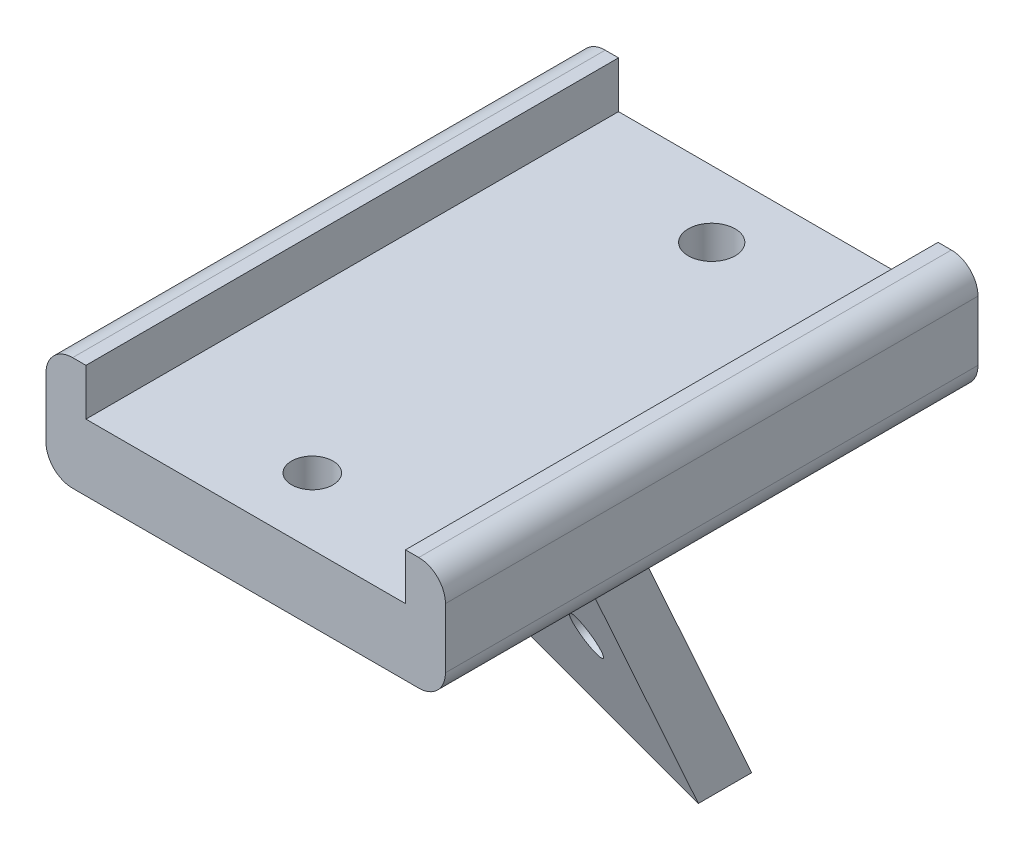
ISO-10303-21;
HEADER;
FILE_DESCRIPTION(('STEP AP214'),'2;1');
FILE_NAME('part.step','',(''),(''),'','','');
FILE_SCHEMA(('AUTOMOTIVE_DESIGN { 1 0 10303 214 1 1 1 1 }'));
ENDSEC;
DATA;
#1=APPLICATION_CONTEXT('core data for automotive mechanical design processes');
#2=APPLICATION_PROTOCOL_DEFINITION('international standard','automotive_design',2000,#1);
#3=PRODUCT_CONTEXT('',#1,'mechanical');
#4=PRODUCT('Part','Part','',(#3));
#5=PRODUCT_RELATED_PRODUCT_CATEGORY('part','',(#4));
#6=PRODUCT_DEFINITION_FORMATION('','',#4);
#7=PRODUCT_DEFINITION_CONTEXT('part definition',#1,'design');
#8=PRODUCT_DEFINITION('design','',#6,#7);
#9=PRODUCT_DEFINITION_SHAPE('','',#8);
#10=(LENGTH_UNIT() NAMED_UNIT(*) SI_UNIT(.MILLI.,.METRE.));
#11=(NAMED_UNIT(*) PLANE_ANGLE_UNIT() SI_UNIT($,.RADIAN.));
#12=(NAMED_UNIT(*) SI_UNIT($,.STERADIAN.) SOLID_ANGLE_UNIT());
#13=UNCERTAINTY_MEASURE_WITH_UNIT(LENGTH_MEASURE(1.E-05),#10,'distance_accuracy_value','');
#14=(GEOMETRIC_REPRESENTATION_CONTEXT(3) GLOBAL_UNCERTAINTY_ASSIGNED_CONTEXT((#13)) GLOBAL_UNIT_ASSIGNED_CONTEXT((#10,
#11,#12)) REPRESENTATION_CONTEXT('',''));
#15=CARTESIAN_POINT('',(0.,0.,0.));
#16=DIRECTION('',(0.,0.,1.));
#17=DIRECTION('',(1.,0.,0.));
#18=AXIS2_PLACEMENT_3D('',#15,#16,#17);
#19=CARTESIAN_POINT('',(0.,0.,0.));
#20=DIRECTION('',(0.,-1.,0.));
#21=DIRECTION('',(0.,0.,-1.));
#22=AXIS2_PLACEMENT_3D('',#19,#20,#21);
#23=PLANE('',#22);
#24=CARTESIAN_POINT('',(0.,0.,-15.));
#25=DIRECTION('',(0.,1.,0.));
#26=DIRECTION('',(0.,0.,1.));
#27=AXIS2_PLACEMENT_3D('',#24,#25,#26);
#28=CIRCLE('',#27,1.76063104913238);
#29=CARTESIAN_POINT('',(0.,0.,-13.2393689508676));
#30=VERTEX_POINT('',#29);
#31=EDGE_CURVE('E478',#30,#30,#28,.T.);
#32=ORIENTED_EDGE('',*,*,#31,.T.);
#33=EDGE_LOOP('',(#32));
#34=FACE_BOUND('',#33,.T.);
#35=DIRECTION('',(-1.,0.,0.));
#36=VECTOR('',#35,1.);
#37=CARTESIAN_POINT('',(-11.,0.,-20.));
#38=LINE('',#37,#36);
#39=CARTESIAN_POINT('',(13.,0.,-20.));
#40=VERTEX_POINT('',#39);
#41=CARTESIAN_POINT('',(-13.,0.,-20.));
#42=VERTEX_POINT('',#41);
#43=EDGE_CURVE('E486',#40,#42,#38,.T.);
#44=ORIENTED_EDGE('',*,*,#43,.F.);
#45=DIRECTION('',(0.,0.,-1.));
#46=VECTOR('',#45,1.);
#47=CARTESIAN_POINT('',(13.,0.,0.));
#48=LINE('',#47,#46);
#49=CARTESIAN_POINT('',(13.,0.,20.));
#50=VERTEX_POINT('',#49);
#51=EDGE_CURVE('E396',#40,#50,#48,.F.);
#52=ORIENTED_EDGE('',*,*,#51,.T.);
#53=DIRECTION('',(1.,0.,0.));
#54=VECTOR('',#53,1.);
#55=CARTESIAN_POINT('',(-11.,0.,20.));
#56=LINE('',#55,#54);
#57=CARTESIAN_POINT('',(-13.,0.,20.));
#58=VERTEX_POINT('',#57);
#59=EDGE_CURVE('E493',#58,#50,#56,.T.);
#60=ORIENTED_EDGE('',*,*,#59,.F.);
#61=DIRECTION('',(0.,0.,-1.));
#62=VECTOR('',#61,1.);
#63=CARTESIAN_POINT('',(-13.,0.,0.));
#64=LINE('',#63,#62);
#65=EDGE_CURVE('E520',#58,#42,#64,.T.);
#66=ORIENTED_EDGE('',*,*,#65,.T.);
#67=EDGE_LOOP('',(#44,#52,#60,#66));
#68=FACE_BOUND('',#67,.T.);
#69=CARTESIAN_POINT('',(0.,0.,15.));
#70=DIRECTION('',(0.,1.,0.));
#71=DIRECTION('',(0.,0.,1.));
#72=AXIS2_PLACEMENT_3D('',#69,#70,#71);
#73=CIRCLE('',#72,1.55539885410863);
#74=CARTESIAN_POINT('',(0.,0.,16.5553988541086));
#75=VERTEX_POINT('',#74);
#76=EDGE_CURVE('E456',#75,#75,#73,.T.);
#77=ORIENTED_EDGE('',*,*,#76,.T.);
#78=EDGE_LOOP('',(#77));
#79=FACE_BOUND('',#78,.T.);
#80=DIRECTION('',(0.965925826289067,0.,0.258819045102525));
#81=VECTOR('',#80,1.);
#82=CARTESIAN_POINT('',(11.,0.,2.));
#83=LINE('',#82,#81);
#84=CARTESIAN_POINT('',(-11.,0.,-3.89488223348481));
#85=VERTEX_POINT('',#84);
#86=CARTESIAN_POINT('',(11.,0.,2.));
#87=VERTEX_POINT('',#86);
#88=EDGE_CURVE('E184',#85,#87,#83,.T.);
#89=ORIENTED_EDGE('',*,*,#88,.F.);
#90=DIRECTION('',(0.,0.,-1.));
#91=VECTOR('',#90,1.);
#92=CARTESIAN_POINT('',(-11.,0.,-3.89488223348481));
#93=LINE('',#92,#91);
#94=CARTESIAN_POINT('',(-11.,0.,0.105117766515197));
#95=VERTEX_POINT('',#94);
#96=EDGE_CURVE('E194',#95,#85,#93,.T.);
#97=ORIENTED_EDGE('',*,*,#96,.F.);
#98=DIRECTION('',(-0.965925826289067,0.,-0.258819045102525));
#99=VECTOR('',#98,1.);
#100=CARTESIAN_POINT('',(-11.,0.,0.105117766515197));
#101=LINE('',#100,#99);
#102=CARTESIAN_POINT('',(11.,0.,6.));
#103=VERTEX_POINT('',#102);
#104=EDGE_CURVE('E190',#103,#95,#101,.T.);
#105=ORIENTED_EDGE('',*,*,#104,.F.);
#106=DIRECTION('',(0.,0.,1.));
#107=VECTOR('',#106,1.);
#108=CARTESIAN_POINT('',(11.,0.,6.));
#109=LINE('',#108,#107);
#110=EDGE_CURVE('E175',#87,#103,#109,.T.);
#111=ORIENTED_EDGE('',*,*,#110,.F.);
#112=EDGE_LOOP('',(#89,#97,#105,#111));
#113=FACE_BOUND('',#112,.T.);
#114=ADVANCED_FACE('F51',(#34,#68,#79,#113),#23,.T.);
#115=CARTESIAN_POINT('',(0.,5.,0.));
#116=DIRECTION('',(0.,-1.,0.));
#117=DIRECTION('',(0.,0.,-1.));
#118=AXIS2_PLACEMENT_3D('',#115,#116,#117);
#119=PLANE('',#118);
#120=DIRECTION('',(1.,0.,0.));
#121=VECTOR('',#120,1.);
#122=CARTESIAN_POINT('',(-11.,5.,20.));
#123=LINE('',#122,#121);
#124=CARTESIAN_POINT('',(-12.,5.,20.));
#125=VERTEX_POINT('',#124);
#126=CARTESIAN_POINT('',(12.,5.,20.));
#127=VERTEX_POINT('',#126);
#128=EDGE_CURVE('E492',#125,#127,#123,.T.);
#129=ORIENTED_EDGE('',*,*,#128,.T.);
#130=DIRECTION('',(0.,0.,-1.));
#131=VECTOR('',#130,1.);
#132=CARTESIAN_POINT('',(12.,5.,29.394147114028));
#133=LINE('',#132,#131);
#134=CARTESIAN_POINT('',(12.,5.,-20.));
#135=VERTEX_POINT('',#134);
#136=EDGE_CURVE('E468',#127,#135,#133,.T.);
#137=ORIENTED_EDGE('',*,*,#136,.T.);
#138=DIRECTION('',(-1.,0.,0.));
#139=VECTOR('',#138,1.);
#140=CARTESIAN_POINT('',(-11.,5.,-20.));
#141=LINE('',#140,#139);
#142=CARTESIAN_POINT('',(-12.,5.,-20.));
#143=VERTEX_POINT('',#142);
#144=EDGE_CURVE('E489',#135,#143,#141,.T.);
#145=ORIENTED_EDGE('',*,*,#144,.T.);
#146=DIRECTION('',(0.,0.,-1.));
#147=VECTOR('',#146,1.);
#148=CARTESIAN_POINT('',(-12.,5.,29.394147114028));
#149=LINE('',#148,#147);
#150=EDGE_CURVE('E418',#125,#143,#149,.T.);
#151=ORIENTED_EDGE('',*,*,#150,.F.);
#152=EDGE_LOOP('',(#129,#137,#145,#151));
#153=FACE_BOUND('',#152,.T.);
#154=CARTESIAN_POINT('',(0.,5.,-15.));
#155=DIRECTION('',(0.,1.,0.));
#156=DIRECTION('',(0.,0.,1.));
#157=AXIS2_PLACEMENT_3D('',#154,#155,#156);
#158=CIRCLE('',#157,1.76063104913238);
#159=CARTESIAN_POINT('',(0.,5.,-13.2393689508676));
#160=VERTEX_POINT('',#159);
#161=EDGE_CURVE('E482',#160,#160,#158,.T.);
#162=ORIENTED_EDGE('',*,*,#161,.F.);
#163=EDGE_LOOP('',(#162));
#164=FACE_BOUND('',#163,.T.);
#165=CARTESIAN_POINT('',(0.,5.,15.));
#166=DIRECTION('',(0.,1.,0.));
#167=DIRECTION('',(0.,0.,1.));
#168=AXIS2_PLACEMENT_3D('',#165,#166,#167);
#169=CIRCLE('',#168,1.55539885410863);
#170=CARTESIAN_POINT('',(0.,5.,16.5553988541086));
#171=VERTEX_POINT('',#170);
#172=EDGE_CURVE('E474',#171,#171,#169,.T.);
#173=ORIENTED_EDGE('',*,*,#172,.F.);
#174=EDGE_LOOP('',(#173));
#175=FACE_BOUND('',#174,.T.);
#176=ADVANCED_FACE('F345',(#153,#164,#175),#119,.F.);
#177=CARTESIAN_POINT('',(-11.,5.,-20.));
#178=DIRECTION('',(0.,0.,1.));
#179=DIRECTION('',(1.,0.,0.));
#180=AXIS2_PLACEMENT_3D('',#177,#178,#179);
#181=PLANE('',#180);
#182=DIRECTION('',(0.,-1.,0.));
#183=VECTOR('',#182,1.);
#184=CARTESIAN_POINT('',(15.,8.5,-20.));
#185=LINE('',#184,#183);
#186=CARTESIAN_POINT('',(15.,6.5,-20.));
#187=VERTEX_POINT('',#186);
#188=CARTESIAN_POINT('',(15.,2.,-20.));
#189=VERTEX_POINT('',#188);
#190=EDGE_CURVE('E464',#187,#189,#185,.T.);
#191=ORIENTED_EDGE('',*,*,#190,.T.);
#192=CARTESIAN_POINT('',(13.,2.,-20.));
#193=DIRECTION('',(0.,0.,1.));
#194=DIRECTION('',(1.,0.,0.));
#195=AXIS2_PLACEMENT_3D('',#192,#193,#194);
#196=CIRCLE('',#195,2.);
#197=EDGE_CURVE('E517',#189,#40,#196,.F.);
#198=ORIENTED_EDGE('',*,*,#197,.T.);
#199=ORIENTED_EDGE('',*,*,#43,.T.);
#200=CARTESIAN_POINT('',(-13.,2.,-20.));
#201=DIRECTION('',(0.,0.,1.));
#202=DIRECTION('',(1.,0.,0.));
#203=AXIS2_PLACEMENT_3D('',#200,#201,#202);
#204=CIRCLE('',#203,2.);
#205=CARTESIAN_POINT('',(-15.,2.,-20.));
#206=VERTEX_POINT('',#205);
#207=EDGE_CURVE('E514',#42,#206,#204,.F.);
#208=ORIENTED_EDGE('',*,*,#207,.T.);
#209=DIRECTION('',(0.,1.,0.));
#210=VECTOR('',#209,1.);
#211=CARTESIAN_POINT('',(-15.,8.5,-20.));
#212=LINE('',#211,#210);
#213=CARTESIAN_POINT('',(-15.,6.5,-20.));
#214=VERTEX_POINT('',#213);
#215=EDGE_CURVE('E305',#206,#214,#212,.T.);
#216=ORIENTED_EDGE('',*,*,#215,.T.);
#217=CARTESIAN_POINT('',(-13.,6.5,-20.));
#218=DIRECTION('',(0.,0.,1.));
#219=DIRECTION('',(1.,0.,0.));
#220=AXIS2_PLACEMENT_3D('',#217,#218,#219);
#221=CIRCLE('',#220,2.);
#222=CARTESIAN_POINT('',(-13.,8.5,-20.));
#223=VERTEX_POINT('',#222);
#224=EDGE_CURVE('E511',#214,#223,#221,.F.);
#225=ORIENTED_EDGE('',*,*,#224,.T.);
#226=DIRECTION('',(1.,0.,0.));
#227=VECTOR('',#226,1.);
#228=CARTESIAN_POINT('',(-12.,8.5,-20.));
#229=LINE('',#228,#227);
#230=CARTESIAN_POINT('',(-12.,8.5,-20.));
#231=VERTEX_POINT('',#230);
#232=EDGE_CURVE('E413',#223,#231,#229,.T.);
#233=ORIENTED_EDGE('',*,*,#232,.T.);
#234=DIRECTION('',(0.,-1.,0.));
#235=VECTOR('',#234,1.);
#236=CARTESIAN_POINT('',(-12.,5.,-20.));
#237=LINE('',#236,#235);
#238=EDGE_CURVE('E435',#231,#143,#237,.T.);
#239=ORIENTED_EDGE('',*,*,#238,.T.);
#240=ORIENTED_EDGE('',*,*,#144,.F.);
#241=DIRECTION('',(0.,1.,0.));
#242=VECTOR('',#241,1.);
#243=CARTESIAN_POINT('',(12.,5.,-20.));
#244=LINE('',#243,#242);
#245=CARTESIAN_POINT('',(12.,8.5,-20.));
#246=VERTEX_POINT('',#245);
#247=EDGE_CURVE('E443',#135,#246,#244,.T.);
#248=ORIENTED_EDGE('',*,*,#247,.T.);
#249=DIRECTION('',(1.,0.,0.));
#250=VECTOR('',#249,1.);
#251=CARTESIAN_POINT('',(12.,8.5,-20.));
#252=LINE('',#251,#250);
#253=CARTESIAN_POINT('',(13.,8.5,-20.));
#254=VERTEX_POINT('',#253);
#255=EDGE_CURVE('E460',#246,#254,#252,.T.);
#256=ORIENTED_EDGE('',*,*,#255,.T.);
#257=CARTESIAN_POINT('',(13.,6.5,-20.));
#258=DIRECTION('',(0.,0.,1.));
#259=DIRECTION('',(1.,0.,0.));
#260=AXIS2_PLACEMENT_3D('',#257,#258,#259);
#261=CIRCLE('',#260,2.);
#262=EDGE_CURVE('E508',#254,#187,#261,.F.);
#263=ORIENTED_EDGE('',*,*,#262,.T.);
#264=EDGE_LOOP('',(#191,#198,#199,#208,#216,#225,#233,#239,#240,#248,#256,#263));
#265=FACE_BOUND('',#264,.T.);
#266=ADVANCED_FACE('F351',(#265),#181,.F.);
#267=CARTESIAN_POINT('',(-11.,5.,20.));
#268=DIRECTION('',(0.,0.,-1.));
#269=DIRECTION('',(-1.,0.,0.));
#270=AXIS2_PLACEMENT_3D('',#267,#268,#269);
#271=PLANE('',#270);
#272=ORIENTED_EDGE('',*,*,#59,.T.);
#273=CARTESIAN_POINT('',(13.,2.,20.));
#274=DIRECTION('',(0.,0.,-1.));
#275=DIRECTION('',(-1.,0.,0.));
#276=AXIS2_PLACEMENT_3D('',#273,#274,#275);
#277=CIRCLE('',#276,2.);
#278=CARTESIAN_POINT('',(15.,2.,20.));
#279=VERTEX_POINT('',#278);
#280=EDGE_CURVE('E394',#50,#279,#277,.F.);
#281=ORIENTED_EDGE('',*,*,#280,.T.);
#282=DIRECTION('',(0.,1.,0.));
#283=VECTOR('',#282,1.);
#284=CARTESIAN_POINT('',(15.,8.5,20.));
#285=LINE('',#284,#283);
#286=CARTESIAN_POINT('',(15.,6.5,20.));
#287=VERTEX_POINT('',#286);
#288=EDGE_CURVE('E452',#279,#287,#285,.T.);
#289=ORIENTED_EDGE('',*,*,#288,.T.);
#290=CARTESIAN_POINT('',(13.,6.5,20.));
#291=DIRECTION('',(0.,0.,-1.));
#292=DIRECTION('',(-1.,0.,0.));
#293=AXIS2_PLACEMENT_3D('',#290,#291,#292);
#294=CIRCLE('',#293,2.);
#295=CARTESIAN_POINT('',(13.,8.5,20.));
#296=VERTEX_POINT('',#295);
#297=EDGE_CURVE('E390',#287,#296,#294,.F.);
#298=ORIENTED_EDGE('',*,*,#297,.T.);
#299=DIRECTION('',(-1.,0.,0.));
#300=VECTOR('',#299,1.);
#301=CARTESIAN_POINT('',(12.,8.5,20.));
#302=LINE('',#301,#300);
#303=CARTESIAN_POINT('',(12.,8.5,20.));
#304=VERTEX_POINT('',#303);
#305=EDGE_CURVE('E448',#296,#304,#302,.T.);
#306=ORIENTED_EDGE('',*,*,#305,.T.);
#307=DIRECTION('',(0.,-1.,0.));
#308=VECTOR('',#307,1.);
#309=CARTESIAN_POINT('',(12.,5.,20.));
#310=LINE('',#309,#308);
#311=EDGE_CURVE('E444',#304,#127,#310,.T.);
#312=ORIENTED_EDGE('',*,*,#311,.T.);
#313=ORIENTED_EDGE('',*,*,#128,.F.);
#314=DIRECTION('',(0.,1.,0.));
#315=VECTOR('',#314,1.);
#316=CARTESIAN_POINT('',(-12.,5.,20.));
#317=LINE('',#316,#315);
#318=CARTESIAN_POINT('',(-12.,8.5,20.));
#319=VERTEX_POINT('',#318);
#320=EDGE_CURVE('E416',#125,#319,#317,.T.);
#321=ORIENTED_EDGE('',*,*,#320,.T.);
#322=DIRECTION('',(-1.,0.,0.));
#323=VECTOR('',#322,1.);
#324=CARTESIAN_POINT('',(-12.,8.5,20.));
#325=LINE('',#324,#323);
#326=CARTESIAN_POINT('',(-13.,8.5,20.));
#327=VERTEX_POINT('',#326);
#328=EDGE_CURVE('E411',#319,#327,#325,.T.);
#329=ORIENTED_EDGE('',*,*,#328,.T.);
#330=CARTESIAN_POINT('',(-13.,6.5,20.));
#331=DIRECTION('',(0.,0.,-1.));
#332=DIRECTION('',(-1.,0.,0.));
#333=AXIS2_PLACEMENT_3D('',#330,#331,#332);
#334=CIRCLE('',#333,2.);
#335=CARTESIAN_POINT('',(-15.,6.5,20.));
#336=VERTEX_POINT('',#335);
#337=EDGE_CURVE('E384',#327,#336,#334,.F.);
#338=ORIENTED_EDGE('',*,*,#337,.T.);
#339=DIRECTION('',(0.,-1.,0.));
#340=VECTOR('',#339,1.);
#341=CARTESIAN_POINT('',(-15.,8.5,20.));
#342=LINE('',#341,#340);
#343=CARTESIAN_POINT('',(-15.,2.,20.));
#344=VERTEX_POINT('',#343);
#345=EDGE_CURVE('E422',#336,#344,#342,.T.);
#346=ORIENTED_EDGE('',*,*,#345,.T.);
#347=CARTESIAN_POINT('',(-13.,2.,20.));
#348=DIRECTION('',(0.,0.,-1.));
#349=DIRECTION('',(-1.,0.,0.));
#350=AXIS2_PLACEMENT_3D('',#347,#348,#349);
#351=CIRCLE('',#350,2.);
#352=EDGE_CURVE('E389',#344,#58,#351,.F.);
#353=ORIENTED_EDGE('',*,*,#352,.T.);
#354=EDGE_LOOP('',(#272,#281,#289,#298,#306,#312,#313,#321,#329,#338,#346,#353));
#355=FACE_BOUND('',#354,.T.);
#356=ADVANCED_FACE('F358',(#355),#271,.F.);
#357=CARTESIAN_POINT('',(0.,5.,-15.));
#358=DIRECTION('',(0.,-1.,0.));
#359=DIRECTION('',(0.,0.,-1.));
#360=AXIS2_PLACEMENT_3D('',#357,#358,#359);
#361=CYLINDRICAL_SURFACE('',#360,1.76063104913238);
#362=ORIENTED_EDGE('',*,*,#161,.T.);
#363=EDGE_LOOP('',(#362));
#364=FACE_BOUND('',#363,.T.);
#365=ORIENTED_EDGE('',*,*,#31,.F.);
#366=EDGE_LOOP('',(#365));
#367=FACE_BOUND('',#366,.T.);
#368=ADVANCED_FACE('F361',(#364,#367),#361,.F.);
#369=CARTESIAN_POINT('',(0.,5.,15.));
#370=DIRECTION('',(0.,-1.,0.));
#371=DIRECTION('',(0.,0.,-1.));
#372=AXIS2_PLACEMENT_3D('',#369,#370,#371);
#373=CYLINDRICAL_SURFACE('',#372,1.55539885410863);
#374=ORIENTED_EDGE('',*,*,#172,.T.);
#375=EDGE_LOOP('',(#374));
#376=FACE_BOUND('',#375,.T.);
#377=ORIENTED_EDGE('',*,*,#76,.F.);
#378=EDGE_LOOP('',(#377));
#379=FACE_BOUND('',#378,.T.);
#380=ADVANCED_FACE('F561',(#376,#379),#373,.F.);
#381=CARTESIAN_POINT('',(15.,8.5,29.394147114028));
#382=DIRECTION('',(1.,0.,0.));
#383=DIRECTION('',(0.,1.,0.));
#384=AXIS2_PLACEMENT_3D('',#381,#382,#383);
#385=PLANE('',#384);
#386=ORIENTED_EDGE('',*,*,#288,.F.);
#387=DIRECTION('',(0.,0.,-1.));
#388=VECTOR('',#387,1.);
#389=CARTESIAN_POINT('',(15.,2.,29.394147114028));
#390=LINE('',#389,#388);
#391=EDGE_CURVE('E504',#279,#189,#390,.T.);
#392=ORIENTED_EDGE('',*,*,#391,.T.);
#393=ORIENTED_EDGE('',*,*,#190,.F.);
#394=DIRECTION('',(0.,0.,-1.));
#395=VECTOR('',#394,1.);
#396=CARTESIAN_POINT('',(15.,6.5,29.394147114028));
#397=LINE('',#396,#395);
#398=EDGE_CURVE('E496',#187,#287,#397,.F.);
#399=ORIENTED_EDGE('',*,*,#398,.T.);
#400=EDGE_LOOP('',(#386,#392,#393,#399));
#401=FACE_BOUND('',#400,.T.);
#402=ADVANCED_FACE('F535',(#401),#385,.T.);
#403=CARTESIAN_POINT('',(12.,8.5,29.394147114028));
#404=DIRECTION('',(0.,1.,0.));
#405=DIRECTION('',(0.,0.,1.));
#406=AXIS2_PLACEMENT_3D('',#403,#404,#405);
#407=PLANE('',#406);
#408=ORIENTED_EDGE('',*,*,#305,.F.);
#409=DIRECTION('',(0.,0.,-1.));
#410=VECTOR('',#409,1.);
#411=CARTESIAN_POINT('',(13.,8.5,29.394147114028));
#412=LINE('',#411,#410);
#413=EDGE_CURVE('E12',#296,#254,#412,.T.);
#414=ORIENTED_EDGE('',*,*,#413,.T.);
#415=ORIENTED_EDGE('',*,*,#255,.F.);
#416=DIRECTION('',(0.,0.,-1.));
#417=VECTOR('',#416,1.);
#418=CARTESIAN_POINT('',(12.,8.5,29.394147114028));
#419=LINE('',#418,#417);
#420=EDGE_CURVE('E449',#304,#246,#419,.T.);
#421=ORIENTED_EDGE('',*,*,#420,.F.);
#422=EDGE_LOOP('',(#408,#414,#415,#421));
#423=FACE_BOUND('',#422,.T.);
#424=ADVANCED_FACE('F542',(#423),#407,.T.);
#425=CARTESIAN_POINT('',(12.,5.,29.394147114028));
#426=DIRECTION('',(-1.,0.,0.));
#427=DIRECTION('',(0.,0.,1.));
#428=AXIS2_PLACEMENT_3D('',#425,#426,#427);
#429=PLANE('',#428);
#430=ORIENTED_EDGE('',*,*,#311,.F.);
#431=ORIENTED_EDGE('',*,*,#420,.T.);
#432=ORIENTED_EDGE('',*,*,#247,.F.);
#433=ORIENTED_EDGE('',*,*,#136,.F.);
#434=EDGE_LOOP('',(#430,#431,#432,#433));
#435=FACE_BOUND('',#434,.T.);
#436=ADVANCED_FACE('F547',(#435),#429,.T.);
#437=CARTESIAN_POINT('',(-12.,5.,29.394147114028));
#438=DIRECTION('',(1.,0.,0.));
#439=DIRECTION('',(0.,0.,-1.));
#440=AXIS2_PLACEMENT_3D('',#437,#438,#439);
#441=PLANE('',#440);
#442=ORIENTED_EDGE('',*,*,#320,.F.);
#443=ORIENTED_EDGE('',*,*,#150,.T.);
#444=ORIENTED_EDGE('',*,*,#238,.F.);
#445=DIRECTION('',(0.,0.,-1.));
#446=VECTOR('',#445,1.);
#447=CARTESIAN_POINT('',(-12.,8.5,29.394147114028));
#448=LINE('',#447,#446);
#449=EDGE_CURVE('E425',#319,#231,#448,.T.);
#450=ORIENTED_EDGE('',*,*,#449,.F.);
#451=EDGE_LOOP('',(#442,#443,#444,#450));
#452=FACE_BOUND('',#451,.T.);
#453=ADVANCED_FACE('F269',(#452),#441,.T.);
#454=CARTESIAN_POINT('',(-12.,8.5,29.394147114028));
#455=DIRECTION('',(0.,1.,0.));
#456=DIRECTION('',(0.,0.,1.));
#457=AXIS2_PLACEMENT_3D('',#454,#455,#456);
#458=PLANE('',#457);
#459=ORIENTED_EDGE('',*,*,#232,.F.);
#460=DIRECTION('',(0.,0.,-1.));
#461=VECTOR('',#460,1.);
#462=CARTESIAN_POINT('',(-13.,8.5,29.394147114028));
#463=LINE('',#462,#461);
#464=EDGE_CURVE('E61',#223,#327,#463,.F.);
#465=ORIENTED_EDGE('',*,*,#464,.T.);
#466=ORIENTED_EDGE('',*,*,#328,.F.);
#467=ORIENTED_EDGE('',*,*,#449,.T.);
#468=EDGE_LOOP('',(#459,#465,#466,#467));
#469=FACE_BOUND('',#468,.T.);
#470=ADVANCED_FACE('F409',(#469),#458,.T.);
#471=CARTESIAN_POINT('',(-15.,8.5,29.394147114028));
#472=DIRECTION('',(-1.,0.,0.));
#473=DIRECTION('',(0.,-1.,0.));
#474=AXIS2_PLACEMENT_3D('',#471,#472,#473);
#475=PLANE('',#474);
#476=ORIENTED_EDGE('',*,*,#215,.F.);
#477=DIRECTION('',(0.,0.,-1.));
#478=VECTOR('',#477,1.);
#479=CARTESIAN_POINT('',(-15.,2.,29.394147114028));
#480=LINE('',#479,#478);
#481=EDGE_CURVE('E77',#206,#344,#480,.F.);
#482=ORIENTED_EDGE('',*,*,#481,.T.);
#483=ORIENTED_EDGE('',*,*,#345,.F.);
#484=DIRECTION('',(0.,0.,-1.));
#485=VECTOR('',#484,1.);
#486=CARTESIAN_POINT('',(-15.,6.5,29.394147114028));
#487=LINE('',#486,#485);
#488=EDGE_CURVE('E386',#336,#214,#487,.T.);
#489=ORIENTED_EDGE('',*,*,#488,.T.);
#490=EDGE_LOOP('',(#476,#482,#483,#489));
#491=FACE_BOUND('',#490,.T.);
#492=ADVANCED_FACE('F370',(#491),#475,.T.);
#493=CARTESIAN_POINT('',(13.,2.,29.394147114028));
#494=DIRECTION('',(0.,0.,-1.));
#495=DIRECTION('',(-1.,0.,0.));
#496=AXIS2_PLACEMENT_3D('',#493,#494,#495);
#497=CYLINDRICAL_SURFACE('',#496,2.);
#498=ORIENTED_EDGE('',*,*,#280,.F.);
#499=ORIENTED_EDGE('',*,*,#51,.F.);
#500=ORIENTED_EDGE('',*,*,#197,.F.);
#501=ORIENTED_EDGE('',*,*,#391,.F.);
#502=EDGE_LOOP('',(#498,#499,#500,#501));
#503=FACE_BOUND('',#502,.T.);
#504=ADVANCED_FACE('F366',(#503),#497,.T.);
#505=CARTESIAN_POINT('',(-13.,2.,0.));
#506=DIRECTION('',(0.,0.,-1.));
#507=DIRECTION('',(-1.,0.,0.));
#508=AXIS2_PLACEMENT_3D('',#505,#506,#507);
#509=CYLINDRICAL_SURFACE('',#508,2.);
#510=ORIENTED_EDGE('',*,*,#352,.F.);
#511=ORIENTED_EDGE('',*,*,#481,.F.);
#512=ORIENTED_EDGE('',*,*,#207,.F.);
#513=ORIENTED_EDGE('',*,*,#65,.F.);
#514=EDGE_LOOP('',(#510,#511,#512,#513));
#515=FACE_BOUND('',#514,.T.);
#516=ADVANCED_FACE('F369',(#515),#509,.T.);
#517=CARTESIAN_POINT('',(-13.,6.5,29.394147114028));
#518=DIRECTION('',(0.,0.,-1.));
#519=DIRECTION('',(-1.,0.,0.));
#520=AXIS2_PLACEMENT_3D('',#517,#518,#519);
#521=CYLINDRICAL_SURFACE('',#520,2.);
#522=ORIENTED_EDGE('',*,*,#337,.F.);
#523=ORIENTED_EDGE('',*,*,#464,.F.);
#524=ORIENTED_EDGE('',*,*,#224,.F.);
#525=ORIENTED_EDGE('',*,*,#488,.F.);
#526=EDGE_LOOP('',(#522,#523,#524,#525));
#527=FACE_BOUND('',#526,.T.);
#528=ADVANCED_FACE('F373',(#527),#521,.T.);
#529=CARTESIAN_POINT('',(13.,6.5,29.394147114028));
#530=DIRECTION('',(0.,0.,-1.));
#531=DIRECTION('',(-1.,0.,0.));
#532=AXIS2_PLACEMENT_3D('',#529,#530,#531);
#533=CYLINDRICAL_SURFACE('',#532,2.);
#534=ORIENTED_EDGE('',*,*,#297,.F.);
#535=ORIENTED_EDGE('',*,*,#398,.F.);
#536=ORIENTED_EDGE('',*,*,#262,.F.);
#537=ORIENTED_EDGE('',*,*,#413,.F.);
#538=EDGE_LOOP('',(#534,#535,#536,#537));
#539=FACE_BOUND('',#538,.T.);
#540=ADVANCED_FACE('F53',(#539),#533,.T.);
#541=CARTESIAN_POINT('',(0.,-20.,0.));
#542=DIRECTION('',(0.,1.,0.));
#543=DIRECTION('',(0.,0.,1.));
#544=AXIS2_PLACEMENT_3D('',#541,#542,#543);
#545=PLANE('',#544);
#546=DIRECTION('',(-0.965925826289069,0.,-0.258819045102518));
#547=VECTOR('',#546,1.);
#548=CARTESIAN_POINT('',(-11.,-20.,-8.89488223348463));
#549=LINE('',#548,#547);
#550=CARTESIAN_POINT('',(11.,-20.,-3.));
#551=VERTEX_POINT('',#550);
#552=CARTESIAN_POINT('',(-11.,-20.,-8.89488223348463));
#553=VERTEX_POINT('',#552);
#554=EDGE_CURVE('E228',#551,#553,#549,.T.);
#555=ORIENTED_EDGE('',*,*,#554,.T.);
#556=DIRECTION('',(0.,0.,-1.));
#557=VECTOR('',#556,1.);
#558=CARTESIAN_POINT('',(-11.,-20.,-12.8948822334846));
#559=LINE('',#558,#557);
#560=CARTESIAN_POINT('',(-11.,-20.,-12.8948822334846));
#561=VERTEX_POINT('',#560);
#562=EDGE_CURVE('E243',#553,#561,#559,.T.);
#563=ORIENTED_EDGE('',*,*,#562,.T.);
#564=DIRECTION('',(0.965925826289069,0.,0.258819045102518));
#565=VECTOR('',#564,1.);
#566=CARTESIAN_POINT('',(11.,-20.,-7.));
#567=LINE('',#566,#565);
#568=CARTESIAN_POINT('',(11.,-20.,-7.));
#569=VERTEX_POINT('',#568);
#570=EDGE_CURVE('E298',#561,#569,#567,.T.);
#571=ORIENTED_EDGE('',*,*,#570,.T.);
#572=DIRECTION('',(0.,0.,1.));
#573=VECTOR('',#572,1.);
#574=CARTESIAN_POINT('',(11.,-20.,-3.));
#575=LINE('',#574,#573);
#576=EDGE_CURVE('E177',#569,#551,#575,.T.);
#577=ORIENTED_EDGE('',*,*,#576,.T.);
#578=EDGE_LOOP('',(#555,#563,#571,#577));
#579=FACE_BOUND('',#578,.T.);
#580=ADVANCED_FACE('F264',(#579),#545,.F.);
#581=CARTESIAN_POINT('',(11.,0.,0.));
#582=DIRECTION('',(-1.,0.,0.));
#583=DIRECTION('',(0.,0.,1.));
#584=AXIS2_PLACEMENT_3D('',#581,#582,#583);
#585=PLANE('',#584);
#586=DIRECTION('',(0.,-0.911921505175106,-0.410364677328798));
#587=VECTOR('',#586,1.);
#588=CARTESIAN_POINT('',(11.,0.,6.));
#589=LINE('',#588,#587);
#590=EDGE_CURVE('E181',#103,#551,#589,.T.);
#591=ORIENTED_EDGE('',*,*,#590,.T.);
#592=ORIENTED_EDGE('',*,*,#576,.F.);
#593=DIRECTION('',(0.,-0.911921505175106,-0.410364677328798));
#594=VECTOR('',#593,1.);
#595=CARTESIAN_POINT('',(11.,0.,2.));
#596=LINE('',#595,#594);
#597=EDGE_CURVE('E171',#87,#569,#596,.T.);
#598=ORIENTED_EDGE('',*,*,#597,.F.);
#599=ORIENTED_EDGE('',*,*,#110,.T.);
#600=EDGE_LOOP('',(#591,#592,#598,#599));
#601=FACE_BOUND('',#600,.T.);
#602=ADVANCED_FACE('F173',(#601),#585,.F.);
#603=CARTESIAN_POINT('',(0.199220533347212,0.334575518563248,-0.743501152362774));
#604=DIRECTION('',(-0.237365262193968,-0.398636648306913,0.885859218459807));
#605=DIRECTION('',(0.,-0.911921505175107,-0.410364677328798));
#606=AXIS2_PLACEMENT_3D('',#603,#604,#605);
#607=PLANE('',#606);
#608=CARTESIAN_POINT('',(6.14289764287495,-9.17108948068132,-3.4284469204535));
#609=DIRECTION('',(-0.237365262193975,-0.398636648306906,0.885859218459808));
#610=DIRECTION('',(0.,-0.911921505175109,-0.410364677328791));
#611=AXIS2_PLACEMENT_3D('',#608,#609,#610);
#612=CIRCLE('',#611,1.5);
#613=CARTESIAN_POINT('',(6.14289764287495,-10.538971738444,-4.04399393644669));
#614=VERTEX_POINT('',#613);
#615=EDGE_CURVE('E210',#614,#614,#612,.T.);
#616=ORIENTED_EDGE('',*,*,#615,.T.);
#617=EDGE_LOOP('',(#616));
#618=FACE_BOUND('',#617,.T.);
#619=CARTESIAN_POINT('',(-6.14289764287496,-9.17108948068132,-6.72041584564434));
#620=DIRECTION('',(-0.237365262193975,-0.398636648306906,0.885859218459808));
#621=DIRECTION('',(0.,-0.911921505175109,-0.410364677328791));
#622=AXIS2_PLACEMENT_3D('',#619,#620,#621);
#623=CIRCLE('',#622,1.5);
#624=CARTESIAN_POINT('',(-6.14289764287496,-10.538971738444,-7.33596286163753));
#625=VERTEX_POINT('',#624);
#626=EDGE_CURVE('E219',#625,#625,#623,.T.);
#627=ORIENTED_EDGE('',*,*,#626,.T.);
#628=EDGE_LOOP('',(#627));
#629=FACE_BOUND('',#628,.T.);
#630=ORIENTED_EDGE('',*,*,#597,.T.);
#631=ORIENTED_EDGE('',*,*,#570,.F.);
#632=DIRECTION('',(0.,-0.911921505175109,-0.410364677328791));
#633=VECTOR('',#632,1.);
#634=CARTESIAN_POINT('',(-11.,0.,-3.89488223348481));
#635=LINE('',#634,#633);
#636=EDGE_CURVE('E69',#85,#561,#635,.T.);
#637=ORIENTED_EDGE('',*,*,#636,.F.);
#638=ORIENTED_EDGE('',*,*,#88,.T.);
#639=EDGE_LOOP('',(#630,#631,#637,#638));
#640=FACE_BOUND('',#639,.T.);
#641=ADVANCED_FACE('F185',(#618,#629,#640),#607,.F.);
#642=CARTESIAN_POINT('',(-0.641868289279378,-1.07796828031107,2.39548506735798));
#643=DIRECTION('',(0.237365262193969,0.398636648306907,-0.885859218459809));
#644=DIRECTION('',(0.,0.911921505175109,0.410364677328792));
#645=AXIS2_PLACEMENT_3D('',#642,#643,#644);
#646=PLANE('',#645);
#647=CARTESIAN_POINT('',(5.30180882024833,-10.5836332795556,-0.289460700732712));
#648=DIRECTION('',(0.237365262193969,0.398636648306907,-0.885859218459809));
#649=DIRECTION('',(0.,0.911921505175109,0.410364677328792));
#650=AXIS2_PLACEMENT_3D('',#647,#648,#649);
#651=CIRCLE('',#650,1.5);
#652=CARTESIAN_POINT('',(5.30180882024833,-9.21575102179299,0.326086315260474));
#653=VERTEX_POINT('',#652);
#654=EDGE_CURVE('E202',#653,#653,#651,.T.);
#655=ORIENTED_EDGE('',*,*,#654,.T.);
#656=EDGE_LOOP('',(#655));
#657=FACE_BOUND('',#656,.T.);
#658=CARTESIAN_POINT('',(-6.9839864655016,-10.5836332795557,-3.58142962592348));
#659=DIRECTION('',(0.237365262193969,0.398636648306907,-0.885859218459809));
#660=DIRECTION('',(0.,0.911921505175109,0.410364677328792));
#661=AXIS2_PLACEMENT_3D('',#658,#659,#660);
#662=CIRCLE('',#661,1.5);
#663=CARTESIAN_POINT('',(-6.9839864655016,-9.21575102179302,-2.96588260993029));
#664=VERTEX_POINT('',#663);
#665=EDGE_CURVE('E216',#664,#664,#662,.T.);
#666=ORIENTED_EDGE('',*,*,#665,.T.);
#667=EDGE_LOOP('',(#666));
#668=FACE_BOUND('',#667,.T.);
#669=DIRECTION('',(0.,-0.911921505175109,-0.410364677328791));
#670=VECTOR('',#669,1.);
#671=CARTESIAN_POINT('',(-11.,0.,0.105117766515197));
#672=LINE('',#671,#670);
#673=EDGE_CURVE('E180',#95,#553,#672,.T.);
#674=ORIENTED_EDGE('',*,*,#673,.T.);
#675=ORIENTED_EDGE('',*,*,#554,.F.);
#676=ORIENTED_EDGE('',*,*,#590,.F.);
#677=ORIENTED_EDGE('',*,*,#104,.T.);
#678=EDGE_LOOP('',(#674,#675,#676,#677));
#679=FACE_BOUND('',#678,.T.);
#680=ADVANCED_FACE('F261',(#657,#668,#679),#646,.F.);
#681=CARTESIAN_POINT('',(-11.,0.,0.));
#682=DIRECTION('',(1.,0.,0.));
#683=DIRECTION('',(0.,0.,-1.));
#684=AXIS2_PLACEMENT_3D('',#681,#682,#683);
#685=PLANE('',#684);
#686=ORIENTED_EDGE('',*,*,#636,.T.);
#687=ORIENTED_EDGE('',*,*,#562,.F.);
#688=ORIENTED_EDGE('',*,*,#673,.F.);
#689=ORIENTED_EDGE('',*,*,#96,.T.);
#690=EDGE_LOOP('',(#686,#687,#688,#689));
#691=FACE_BOUND('',#690,.T.);
#692=ADVANCED_FACE('F250',(#691),#685,.F.);
#693=CARTESIAN_POINT('',(-7.9910419845945,-12.2749053430394,0.17695273737379));
#694=DIRECTION('',(0.237365262193975,0.398636648306906,-0.885859218459808));
#695=DIRECTION('',(0.,0.911921505175109,0.410364677328791));
#696=AXIS2_PLACEMENT_3D('',#693,#694,#695);
#697=CYLINDRICAL_SURFACE('',#696,1.5);
#698=ORIENTED_EDGE('',*,*,#665,.F.);
#699=EDGE_LOOP('',(#698));
#700=FACE_BOUND('',#699,.T.);
#701=ORIENTED_EDGE('',*,*,#626,.F.);
#702=EDGE_LOOP('',(#701));
#703=FACE_BOUND('',#702,.T.);
#704=ADVANCED_FACE('F260',(#700,#703),#697,.F.);
#705=CARTESIAN_POINT('',(4.29475330115542,-12.2749053430394,3.46892166256463));
#706=DIRECTION('',(0.237365262193975,0.398636648306906,-0.885859218459808));
#707=DIRECTION('',(0.,0.911921505175109,0.410364677328791));
#708=AXIS2_PLACEMENT_3D('',#705,#706,#707);
#709=CYLINDRICAL_SURFACE('',#708,1.5);
#710=ORIENTED_EDGE('',*,*,#654,.F.);
#711=EDGE_LOOP('',(#710));
#712=FACE_BOUND('',#711,.T.);
#713=ORIENTED_EDGE('',*,*,#615,.F.);
#714=EDGE_LOOP('',(#713));
#715=FACE_BOUND('',#714,.T.);
#716=ADVANCED_FACE('F677',(#712,#715),#709,.F.);
#717=CLOSED_SHELL('',(#114,#176,#266,#356,#368,#380,#402,#424,#436,#453,#470,#492,#504,#516,
#528,#540,#580,#602,#641,#680,#692,#704,#716));
#718=MANIFOLD_SOLID_BREP('B2',#717);
#719=ADVANCED_BREP_SHAPE_REPRESENTATION('',(#18,#718),#14);
#720=SHAPE_DEFINITION_REPRESENTATION(#9,#719);
ENDSEC;
END-ISO-10303-21;
